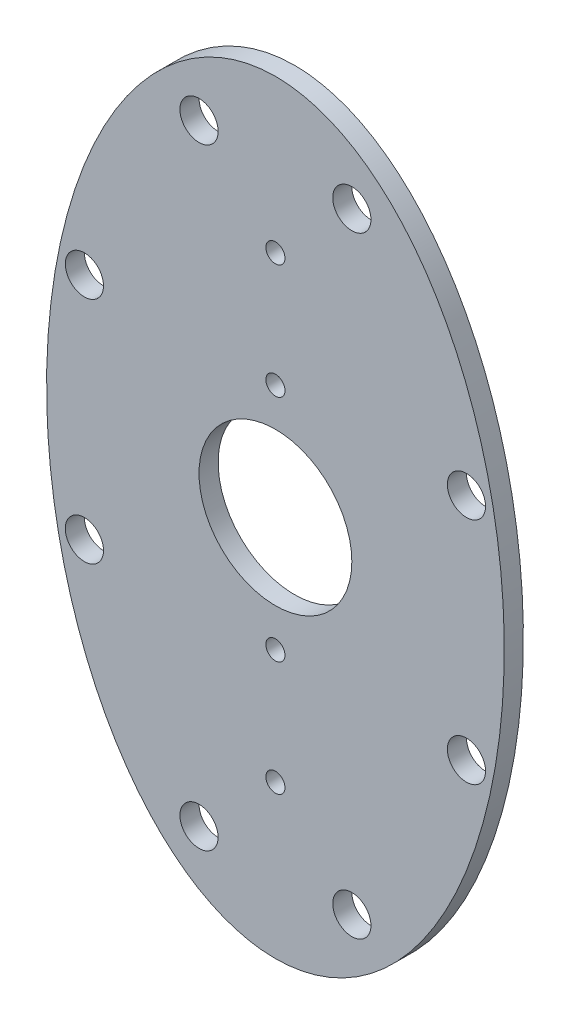
ISO-10303-21;
HEADER;
FILE_DESCRIPTION(('STEP AP214'),'2;1');
FILE_NAME('part.step','',(''),(''),'','','');
FILE_SCHEMA(('AUTOMOTIVE_DESIGN { 1 0 10303 214 1 1 1 1 }'));
ENDSEC;
DATA;
#1=APPLICATION_CONTEXT('core data for automotive mechanical design processes');
#2=APPLICATION_PROTOCOL_DEFINITION('international standard','automotive_design',2000,#1);
#3=PRODUCT_CONTEXT('',#1,'mechanical');
#4=PRODUCT('Part','Part','',(#3));
#5=PRODUCT_RELATED_PRODUCT_CATEGORY('part','',(#4));
#6=PRODUCT_DEFINITION_FORMATION('','',#4);
#7=PRODUCT_DEFINITION_CONTEXT('part definition',#1,'design');
#8=PRODUCT_DEFINITION('design','',#6,#7);
#9=PRODUCT_DEFINITION_SHAPE('','',#8);
#10=(LENGTH_UNIT() NAMED_UNIT(*) SI_UNIT(.MILLI.,.METRE.));
#11=(NAMED_UNIT(*) PLANE_ANGLE_UNIT() SI_UNIT($,.RADIAN.));
#12=(NAMED_UNIT(*) SI_UNIT($,.STERADIAN.) SOLID_ANGLE_UNIT());
#13=UNCERTAINTY_MEASURE_WITH_UNIT(LENGTH_MEASURE(1.E-05),#10,'distance_accuracy_value','');
#14=(GEOMETRIC_REPRESENTATION_CONTEXT(3) GLOBAL_UNCERTAINTY_ASSIGNED_CONTEXT((#13)) GLOBAL_UNIT_ASSIGNED_CONTEXT((#10,
#11,#12)) REPRESENTATION_CONTEXT('',''));
#15=CARTESIAN_POINT('',(0.,0.,0.));
#16=DIRECTION('',(0.,0.,1.));
#17=DIRECTION('',(1.,0.,0.));
#18=AXIS2_PLACEMENT_3D('',#15,#16,#17);
#19=CARTESIAN_POINT('',(0.,0.,12.7));
#20=DIRECTION('',(0.,0.,1.));
#21=DIRECTION('',(0.,1.,0.));
#22=AXIS2_PLACEMENT_3D('',#19,#20,#21);
#23=ELLIPSE('',#22,254.,152.143434343434);
#24=DIRECTION('',(0.,0.,-1.));
#25=VECTOR('',#24,1.);
#26=SURFACE_OF_LINEAR_EXTRUSION('',#23,#25);
#27=CARTESIAN_POINT('',(0.,254.,12.7));
#28=VERTEX_POINT('',#27);
#29=EDGE_CURVE('E10',#28,#28,#23,.T.);
#30=ORIENTED_EDGE('',*,*,#29,.F.);
#31=EDGE_LOOP('',(#30));
#32=FACE_BOUND('',#31,.T.);
#33=CARTESIAN_POINT('',(0.,0.,0.));
#34=DIRECTION('',(0.,0.,1.));
#35=DIRECTION('',(0.,1.,0.));
#36=AXIS2_PLACEMENT_3D('',#33,#34,#35);
#37=ELLIPSE('',#36,254.,152.143434343434);
#38=CARTESIAN_POINT('',(0.,254.,0.));
#39=VERTEX_POINT('',#38);
#40=EDGE_CURVE('E43',#39,#39,#37,.T.);
#41=ORIENTED_EDGE('',*,*,#40,.T.);
#42=EDGE_LOOP('',(#41));
#43=FACE_BOUND('',#42,.T.);
#44=ADVANCED_FACE('F39',(#32,#43),#26,.F.);
#45=CARTESIAN_POINT('',(0.,0.,12.7));
#46=DIRECTION('',(0.,0.,1.));
#47=DIRECTION('',(1.,0.,0.));
#48=AXIS2_PLACEMENT_3D('',#45,#46,#47);
#49=PLANE('',#48);
#50=CARTESIAN_POINT('',(-127.,-76.2,12.7));
#51=DIRECTION('',(0.,0.,1.));
#52=DIRECTION('',(1.,0.,0.));
#53=AXIS2_PLACEMENT_3D('',#50,#51,#52);
#54=CIRCLE('',#53,12.7);
#55=CARTESIAN_POINT('',(-114.3,-76.2,12.7));
#56=VERTEX_POINT('',#55);
#57=EDGE_CURVE('E85',#56,#56,#54,.T.);
#58=ORIENTED_EDGE('',*,*,#57,.F.);
#59=EDGE_LOOP('',(#58));
#60=FACE_BOUND('',#59,.T.);
#61=CARTESIAN_POINT('',(-127.,76.2,12.7));
#62=DIRECTION('',(0.,0.,1.));
#63=DIRECTION('',(1.,0.,0.));
#64=AXIS2_PLACEMENT_3D('',#61,#62,#63);
#65=CIRCLE('',#64,12.7);
#66=CARTESIAN_POINT('',(-114.3,76.2,12.7));
#67=VERTEX_POINT('',#66);
#68=EDGE_CURVE('E92',#67,#67,#65,.T.);
#69=ORIENTED_EDGE('',*,*,#68,.F.);
#70=EDGE_LOOP('',(#69));
#71=FACE_BOUND('',#70,.T.);
#72=CARTESIAN_POINT('',(50.8,-203.2,12.7));
#73=DIRECTION('',(0.,0.,1.));
#74=DIRECTION('',(1.,0.,0.));
#75=AXIS2_PLACEMENT_3D('',#72,#73,#74);
#76=CIRCLE('',#75,12.7);
#77=CARTESIAN_POINT('',(63.5,-203.2,12.7));
#78=VERTEX_POINT('',#77);
#79=EDGE_CURVE('E98',#78,#78,#76,.T.);
#80=ORIENTED_EDGE('',*,*,#79,.F.);
#81=EDGE_LOOP('',(#80));
#82=FACE_BOUND('',#81,.T.);
#83=CARTESIAN_POINT('',(-50.8,-203.2,12.7));
#84=DIRECTION('',(0.,0.,1.));
#85=DIRECTION('',(1.,0.,0.));
#86=AXIS2_PLACEMENT_3D('',#83,#84,#85);
#87=CIRCLE('',#86,12.7);
#88=CARTESIAN_POINT('',(-38.1,-203.2,12.7));
#89=VERTEX_POINT('',#88);
#90=EDGE_CURVE('E62',#89,#89,#87,.T.);
#91=ORIENTED_EDGE('',*,*,#90,.F.);
#92=EDGE_LOOP('',(#91));
#93=FACE_BOUND('',#92,.T.);
#94=CARTESIAN_POINT('',(127.,-76.2,12.7));
#95=DIRECTION('',(0.,0.,1.));
#96=DIRECTION('',(1.,0.,0.));
#97=AXIS2_PLACEMENT_3D('',#94,#95,#96);
#98=CIRCLE('',#97,12.7);
#99=CARTESIAN_POINT('',(139.7,-76.2,12.7));
#100=VERTEX_POINT('',#99);
#101=EDGE_CURVE('E61',#100,#100,#98,.T.);
#102=ORIENTED_EDGE('',*,*,#101,.F.);
#103=EDGE_LOOP('',(#102));
#104=FACE_BOUND('',#103,.T.);
#105=CARTESIAN_POINT('',(127.,76.2,12.7));
#106=DIRECTION('',(0.,0.,1.));
#107=DIRECTION('',(1.,0.,0.));
#108=AXIS2_PLACEMENT_3D('',#105,#106,#107);
#109=CIRCLE('',#108,12.7);
#110=CARTESIAN_POINT('',(139.7,76.2,12.7));
#111=VERTEX_POINT('',#110);
#112=EDGE_CURVE('E68',#111,#111,#109,.T.);
#113=ORIENTED_EDGE('',*,*,#112,.F.);
#114=EDGE_LOOP('',(#113));
#115=FACE_BOUND('',#114,.T.);
#116=CARTESIAN_POINT('',(50.8,203.2,12.7));
#117=DIRECTION('',(0.,0.,1.));
#118=DIRECTION('',(1.,0.,0.));
#119=AXIS2_PLACEMENT_3D('',#116,#117,#118);
#120=CIRCLE('',#119,12.7);
#121=CARTESIAN_POINT('',(63.5,203.2,12.7));
#122=VERTEX_POINT('',#121);
#123=EDGE_CURVE('E74',#122,#122,#120,.T.);
#124=ORIENTED_EDGE('',*,*,#123,.F.);
#125=EDGE_LOOP('',(#124));
#126=FACE_BOUND('',#125,.T.);
#127=CARTESIAN_POINT('',(-50.8,203.2,12.7));
#128=DIRECTION('',(0.,0.,1.));
#129=DIRECTION('',(1.,0.,0.));
#130=AXIS2_PLACEMENT_3D('',#127,#128,#129);
#131=CIRCLE('',#130,12.7);
#132=CARTESIAN_POINT('',(-38.1,203.2,12.7));
#133=VERTEX_POINT('',#132);
#134=EDGE_CURVE('E55',#133,#133,#131,.T.);
#135=ORIENTED_EDGE('',*,*,#134,.F.);
#136=EDGE_LOOP('',(#135));
#137=FACE_BOUND('',#136,.T.);
#138=CARTESIAN_POINT('',(0.,76.2,12.7));
#139=DIRECTION('',(0.,0.,1.));
#140=DIRECTION('',(1.,0.,0.));
#141=AXIS2_PLACEMENT_3D('',#138,#139,#140);
#142=CIRCLE('',#141,6.35);
#143=CARTESIAN_POINT('',(6.35000000000003,76.2,12.7));
#144=VERTEX_POINT('',#143);
#145=EDGE_CURVE('E86',#144,#144,#142,.T.);
#146=ORIENTED_EDGE('',*,*,#145,.F.);
#147=EDGE_LOOP('',(#146));
#148=FACE_BOUND('',#147,.T.);
#149=CARTESIAN_POINT('',(0.,152.4,12.7));
#150=DIRECTION('',(0.,0.,1.));
#151=DIRECTION('',(1.,0.,0.));
#152=AXIS2_PLACEMENT_3D('',#149,#150,#151);
#153=CIRCLE('',#152,6.35);
#154=CARTESIAN_POINT('',(6.35000000000002,152.4,12.7));
#155=VERTEX_POINT('',#154);
#156=EDGE_CURVE('E121',#155,#155,#153,.T.);
#157=ORIENTED_EDGE('',*,*,#156,.F.);
#158=EDGE_LOOP('',(#157));
#159=FACE_BOUND('',#158,.T.);
#160=CARTESIAN_POINT('',(0.,-76.2,12.7));
#161=DIRECTION('',(0.,0.,1.));
#162=DIRECTION('',(1.,0.,0.));
#163=AXIS2_PLACEMENT_3D('',#160,#161,#162);
#164=CIRCLE('',#163,6.35);
#165=CARTESIAN_POINT('',(6.35000000000005,-76.2,12.7));
#166=VERTEX_POINT('',#165);
#167=EDGE_CURVE('E115',#166,#166,#164,.T.);
#168=ORIENTED_EDGE('',*,*,#167,.F.);
#169=EDGE_LOOP('',(#168));
#170=FACE_BOUND('',#169,.T.);
#171=CARTESIAN_POINT('',(0.,-152.4,12.7));
#172=DIRECTION('',(0.,0.,1.));
#173=DIRECTION('',(1.,0.,0.));
#174=AXIS2_PLACEMENT_3D('',#171,#172,#173);
#175=CIRCLE('',#174,6.35);
#176=CARTESIAN_POINT('',(6.35000000000006,-152.4,12.7));
#177=VERTEX_POINT('',#176);
#178=EDGE_CURVE('E109',#177,#177,#175,.T.);
#179=ORIENTED_EDGE('',*,*,#178,.F.);
#180=EDGE_LOOP('',(#179));
#181=FACE_BOUND('',#180,.T.);
#182=CARTESIAN_POINT('',(0.,0.,12.7));
#183=DIRECTION('',(0.,0.,1.));
#184=DIRECTION('',(1.,0.,0.));
#185=AXIS2_PLACEMENT_3D('',#182,#183,#184);
#186=CIRCLE('',#185,50.8);
#187=CARTESIAN_POINT('',(50.8,0.,12.7));
#188=VERTEX_POINT('',#187);
#189=EDGE_CURVE('E52',#188,#188,#186,.T.);
#190=ORIENTED_EDGE('',*,*,#189,.F.);
#191=EDGE_LOOP('',(#190));
#192=FACE_BOUND('',#191,.T.);
#193=ORIENTED_EDGE('',*,*,#29,.T.);
#194=EDGE_LOOP('',(#193));
#195=FACE_BOUND('',#194,.T.);
#196=ADVANCED_FACE('F132',(#60,#71,#82,#93,#104,#115,#126,#137,#148,#159,#170,#181,#192,#195),
#49,.T.);
#197=CARTESIAN_POINT('',(0.,0.,0.));
#198=DIRECTION('',(0.,0.,1.));
#199=DIRECTION('',(1.,0.,0.));
#200=AXIS2_PLACEMENT_3D('',#197,#198,#199);
#201=PLANE('',#200);
#202=CARTESIAN_POINT('',(-127.,-76.2,0.));
#203=DIRECTION('',(0.,0.,1.));
#204=DIRECTION('',(1.,0.,0.));
#205=AXIS2_PLACEMENT_3D('',#202,#203,#204);
#206=CIRCLE('',#205,12.7);
#207=CARTESIAN_POINT('',(-114.3,-76.2,0.));
#208=VERTEX_POINT('',#207);
#209=EDGE_CURVE('E82',#208,#208,#206,.T.);
#210=ORIENTED_EDGE('',*,*,#209,.T.);
#211=EDGE_LOOP('',(#210));
#212=FACE_BOUND('',#211,.T.);
#213=CARTESIAN_POINT('',(-127.,76.2,0.));
#214=DIRECTION('',(0.,0.,1.));
#215=DIRECTION('',(1.,0.,0.));
#216=AXIS2_PLACEMENT_3D('',#213,#214,#215);
#217=CIRCLE('',#216,12.7);
#218=CARTESIAN_POINT('',(-114.3,76.2,0.));
#219=VERTEX_POINT('',#218);
#220=EDGE_CURVE('E89',#219,#219,#217,.T.);
#221=ORIENTED_EDGE('',*,*,#220,.T.);
#222=EDGE_LOOP('',(#221));
#223=FACE_BOUND('',#222,.T.);
#224=CARTESIAN_POINT('',(50.8,-203.2,0.));
#225=DIRECTION('',(0.,0.,1.));
#226=DIRECTION('',(1.,0.,0.));
#227=AXIS2_PLACEMENT_3D('',#224,#225,#226);
#228=CIRCLE('',#227,12.7);
#229=CARTESIAN_POINT('',(63.5,-203.2,0.));
#230=VERTEX_POINT('',#229);
#231=EDGE_CURVE('E95',#230,#230,#228,.T.);
#232=ORIENTED_EDGE('',*,*,#231,.T.);
#233=EDGE_LOOP('',(#232));
#234=FACE_BOUND('',#233,.T.);
#235=CARTESIAN_POINT('',(-50.8,-203.2,0.));
#236=DIRECTION('',(0.,0.,1.));
#237=DIRECTION('',(1.,0.,0.));
#238=AXIS2_PLACEMENT_3D('',#235,#236,#237);
#239=CIRCLE('',#238,12.7);
#240=CARTESIAN_POINT('',(-38.1,-203.2,0.));
#241=VERTEX_POINT('',#240);
#242=EDGE_CURVE('E101',#241,#241,#239,.T.);
#243=ORIENTED_EDGE('',*,*,#242,.T.);
#244=EDGE_LOOP('',(#243));
#245=FACE_BOUND('',#244,.T.);
#246=CARTESIAN_POINT('',(127.,-76.2,0.));
#247=DIRECTION('',(0.,0.,1.));
#248=DIRECTION('',(1.,0.,0.));
#249=AXIS2_PLACEMENT_3D('',#246,#247,#248);
#250=CIRCLE('',#249,12.7);
#251=CARTESIAN_POINT('',(139.7,-76.2,0.));
#252=VERTEX_POINT('',#251);
#253=EDGE_CURVE('E58',#252,#252,#250,.T.);
#254=ORIENTED_EDGE('',*,*,#253,.T.);
#255=EDGE_LOOP('',(#254));
#256=FACE_BOUND('',#255,.T.);
#257=CARTESIAN_POINT('',(127.,76.2,0.));
#258=DIRECTION('',(0.,0.,1.));
#259=DIRECTION('',(1.,0.,0.));
#260=AXIS2_PLACEMENT_3D('',#257,#258,#259);
#261=CIRCLE('',#260,12.7);
#262=CARTESIAN_POINT('',(139.7,76.2,0.));
#263=VERTEX_POINT('',#262);
#264=EDGE_CURVE('E65',#263,#263,#261,.T.);
#265=ORIENTED_EDGE('',*,*,#264,.T.);
#266=EDGE_LOOP('',(#265));
#267=FACE_BOUND('',#266,.T.);
#268=CARTESIAN_POINT('',(50.8,203.2,0.));
#269=DIRECTION('',(0.,0.,1.));
#270=DIRECTION('',(1.,0.,0.));
#271=AXIS2_PLACEMENT_3D('',#268,#269,#270);
#272=CIRCLE('',#271,12.7);
#273=CARTESIAN_POINT('',(63.5,203.2,0.));
#274=VERTEX_POINT('',#273);
#275=EDGE_CURVE('E71',#274,#274,#272,.T.);
#276=ORIENTED_EDGE('',*,*,#275,.T.);
#277=EDGE_LOOP('',(#276));
#278=FACE_BOUND('',#277,.T.);
#279=CARTESIAN_POINT('',(-50.8,203.2,0.));
#280=DIRECTION('',(0.,0.,1.));
#281=DIRECTION('',(1.,0.,0.));
#282=AXIS2_PLACEMENT_3D('',#279,#280,#281);
#283=CIRCLE('',#282,12.7);
#284=CARTESIAN_POINT('',(-38.1,203.2,0.));
#285=VERTEX_POINT('',#284);
#286=EDGE_CURVE('E77',#285,#285,#283,.T.);
#287=ORIENTED_EDGE('',*,*,#286,.T.);
#288=EDGE_LOOP('',(#287));
#289=FACE_BOUND('',#288,.T.);
#290=CARTESIAN_POINT('',(0.,76.2,0.));
#291=DIRECTION('',(0.,0.,1.));
#292=DIRECTION('',(1.,0.,0.));
#293=AXIS2_PLACEMENT_3D('',#290,#291,#292);
#294=CIRCLE('',#293,6.35);
#295=CARTESIAN_POINT('',(6.35000000000003,76.2,0.));
#296=VERTEX_POINT('',#295);
#297=EDGE_CURVE('E124',#296,#296,#294,.T.);
#298=ORIENTED_EDGE('',*,*,#297,.T.);
#299=EDGE_LOOP('',(#298));
#300=FACE_BOUND('',#299,.T.);
#301=CARTESIAN_POINT('',(0.,152.4,0.));
#302=DIRECTION('',(0.,0.,1.));
#303=DIRECTION('',(1.,0.,0.));
#304=AXIS2_PLACEMENT_3D('',#301,#302,#303);
#305=CIRCLE('',#304,6.35);
#306=CARTESIAN_POINT('',(6.35000000000002,152.4,0.));
#307=VERTEX_POINT('',#306);
#308=EDGE_CURVE('E118',#307,#307,#305,.T.);
#309=ORIENTED_EDGE('',*,*,#308,.T.);
#310=EDGE_LOOP('',(#309));
#311=FACE_BOUND('',#310,.T.);
#312=CARTESIAN_POINT('',(0.,-76.2,0.));
#313=DIRECTION('',(0.,0.,1.));
#314=DIRECTION('',(1.,0.,0.));
#315=AXIS2_PLACEMENT_3D('',#312,#313,#314);
#316=CIRCLE('',#315,6.35);
#317=CARTESIAN_POINT('',(6.35000000000005,-76.2,0.));
#318=VERTEX_POINT('',#317);
#319=EDGE_CURVE('E112',#318,#318,#316,.T.);
#320=ORIENTED_EDGE('',*,*,#319,.T.);
#321=EDGE_LOOP('',(#320));
#322=FACE_BOUND('',#321,.T.);
#323=CARTESIAN_POINT('',(0.,-152.4,0.));
#324=DIRECTION('',(0.,0.,1.));
#325=DIRECTION('',(1.,0.,0.));
#326=AXIS2_PLACEMENT_3D('',#323,#324,#325);
#327=CIRCLE('',#326,6.35);
#328=CARTESIAN_POINT('',(6.35000000000006,-152.4,0.));
#329=VERTEX_POINT('',#328);
#330=EDGE_CURVE('E106',#329,#329,#327,.T.);
#331=ORIENTED_EDGE('',*,*,#330,.T.);
#332=EDGE_LOOP('',(#331));
#333=FACE_BOUND('',#332,.T.);
#334=CARTESIAN_POINT('',(0.,0.,0.));
#335=DIRECTION('',(0.,0.,1.));
#336=DIRECTION('',(1.,0.,0.));
#337=AXIS2_PLACEMENT_3D('',#334,#335,#336);
#338=CIRCLE('',#337,50.8);
#339=CARTESIAN_POINT('',(50.8,0.,0.));
#340=VERTEX_POINT('',#339);
#341=EDGE_CURVE('E49',#340,#340,#338,.T.);
#342=ORIENTED_EDGE('',*,*,#341,.T.);
#343=EDGE_LOOP('',(#342));
#344=FACE_BOUND('',#343,.T.);
#345=ORIENTED_EDGE('',*,*,#40,.F.);
#346=EDGE_LOOP('',(#345));
#347=FACE_BOUND('',#346,.T.);
#348=ADVANCED_FACE('F135',(#212,#223,#234,#245,#256,#267,#278,#289,#300,#311,#322,#333,#344,
#347),#201,.F.);
#349=CARTESIAN_POINT('',(0.,0.,0.));
#350=DIRECTION('',(0.,0.,1.));
#351=DIRECTION('',(1.,0.,0.));
#352=AXIS2_PLACEMENT_3D('',#349,#350,#351);
#353=CYLINDRICAL_SURFACE('',#352,50.8);
#354=ORIENTED_EDGE('',*,*,#341,.F.);
#355=EDGE_LOOP('',(#354));
#356=FACE_BOUND('',#355,.T.);
#357=ORIENTED_EDGE('',*,*,#189,.T.);
#358=EDGE_LOOP('',(#357));
#359=FACE_BOUND('',#358,.T.);
#360=ADVANCED_FACE('F146',(#356,#359),#353,.F.);
#361=CARTESIAN_POINT('',(0.,-152.4,0.));
#362=DIRECTION('',(0.,0.,1.));
#363=DIRECTION('',(1.,0.,0.));
#364=AXIS2_PLACEMENT_3D('',#361,#362,#363);
#365=CYLINDRICAL_SURFACE('',#364,6.35);
#366=ORIENTED_EDGE('',*,*,#330,.F.);
#367=EDGE_LOOP('',(#366));
#368=FACE_BOUND('',#367,.T.);
#369=ORIENTED_EDGE('',*,*,#178,.T.);
#370=EDGE_LOOP('',(#369));
#371=FACE_BOUND('',#370,.T.);
#372=ADVANCED_FACE('F148',(#368,#371),#365,.F.);
#373=CARTESIAN_POINT('',(0.,-76.2,0.));
#374=DIRECTION('',(0.,0.,1.));
#375=DIRECTION('',(1.,0.,0.));
#376=AXIS2_PLACEMENT_3D('',#373,#374,#375);
#377=CYLINDRICAL_SURFACE('',#376,6.35);
#378=ORIENTED_EDGE('',*,*,#319,.F.);
#379=EDGE_LOOP('',(#378));
#380=FACE_BOUND('',#379,.T.);
#381=ORIENTED_EDGE('',*,*,#167,.T.);
#382=EDGE_LOOP('',(#381));
#383=FACE_BOUND('',#382,.T.);
#384=ADVANCED_FACE('F155',(#380,#383),#377,.F.);
#385=CARTESIAN_POINT('',(0.,152.4,0.));
#386=DIRECTION('',(0.,0.,1.));
#387=DIRECTION('',(1.,0.,0.));
#388=AXIS2_PLACEMENT_3D('',#385,#386,#387);
#389=CYLINDRICAL_SURFACE('',#388,6.35);
#390=ORIENTED_EDGE('',*,*,#308,.F.);
#391=EDGE_LOOP('',(#390));
#392=FACE_BOUND('',#391,.T.);
#393=ORIENTED_EDGE('',*,*,#156,.T.);
#394=EDGE_LOOP('',(#393));
#395=FACE_BOUND('',#394,.T.);
#396=ADVANCED_FACE('F198',(#392,#395),#389,.F.);
#397=CARTESIAN_POINT('',(0.,76.2,0.));
#398=DIRECTION('',(0.,0.,1.));
#399=DIRECTION('',(1.,0.,0.));
#400=AXIS2_PLACEMENT_3D('',#397,#398,#399);
#401=CYLINDRICAL_SURFACE('',#400,6.35);
#402=ORIENTED_EDGE('',*,*,#297,.F.);
#403=EDGE_LOOP('',(#402));
#404=FACE_BOUND('',#403,.T.);
#405=ORIENTED_EDGE('',*,*,#145,.T.);
#406=EDGE_LOOP('',(#405));
#407=FACE_BOUND('',#406,.T.);
#408=ADVANCED_FACE('F130',(#404,#407),#401,.F.);
#409=CARTESIAN_POINT('',(-50.8,203.2,0.));
#410=DIRECTION('',(0.,0.,1.));
#411=DIRECTION('',(1.,0.,0.));
#412=AXIS2_PLACEMENT_3D('',#409,#410,#411);
#413=CYLINDRICAL_SURFACE('',#412,12.7);
#414=ORIENTED_EDGE('',*,*,#286,.F.);
#415=EDGE_LOOP('',(#414));
#416=FACE_BOUND('',#415,.T.);
#417=ORIENTED_EDGE('',*,*,#134,.T.);
#418=EDGE_LOOP('',(#417));
#419=FACE_BOUND('',#418,.T.);
#420=ADVANCED_FACE('F217',(#416,#419),#413,.F.);
#421=CARTESIAN_POINT('',(50.8,203.2,0.));
#422=DIRECTION('',(0.,0.,1.));
#423=DIRECTION('',(1.,0.,0.));
#424=AXIS2_PLACEMENT_3D('',#421,#422,#423);
#425=CYLINDRICAL_SURFACE('',#424,12.7);
#426=ORIENTED_EDGE('',*,*,#275,.F.);
#427=EDGE_LOOP('',(#426));
#428=FACE_BOUND('',#427,.T.);
#429=ORIENTED_EDGE('',*,*,#123,.T.);
#430=EDGE_LOOP('',(#429));
#431=FACE_BOUND('',#430,.T.);
#432=ADVANCED_FACE('F227',(#428,#431),#425,.F.);
#433=CARTESIAN_POINT('',(127.,76.2,0.));
#434=DIRECTION('',(0.,0.,1.));
#435=DIRECTION('',(1.,0.,0.));
#436=AXIS2_PLACEMENT_3D('',#433,#434,#435);
#437=CYLINDRICAL_SURFACE('',#436,12.7);
#438=ORIENTED_EDGE('',*,*,#264,.F.);
#439=EDGE_LOOP('',(#438));
#440=FACE_BOUND('',#439,.T.);
#441=ORIENTED_EDGE('',*,*,#112,.T.);
#442=EDGE_LOOP('',(#441));
#443=FACE_BOUND('',#442,.T.);
#444=ADVANCED_FACE('F237',(#440,#443),#437,.F.);
#445=CARTESIAN_POINT('',(127.,-76.2,0.));
#446=DIRECTION('',(0.,0.,1.));
#447=DIRECTION('',(1.,0.,0.));
#448=AXIS2_PLACEMENT_3D('',#445,#446,#447);
#449=CYLINDRICAL_SURFACE('',#448,12.7);
#450=ORIENTED_EDGE('',*,*,#253,.F.);
#451=EDGE_LOOP('',(#450));
#452=FACE_BOUND('',#451,.T.);
#453=ORIENTED_EDGE('',*,*,#101,.T.);
#454=EDGE_LOOP('',(#453));
#455=FACE_BOUND('',#454,.T.);
#456=ADVANCED_FACE('F247',(#452,#455),#449,.F.);
#457=CARTESIAN_POINT('',(-50.8,-203.2,0.));
#458=DIRECTION('',(0.,0.,1.));
#459=DIRECTION('',(1.,0.,0.));
#460=AXIS2_PLACEMENT_3D('',#457,#458,#459);
#461=CYLINDRICAL_SURFACE('',#460,12.7);
#462=ORIENTED_EDGE('',*,*,#242,.F.);
#463=EDGE_LOOP('',(#462));
#464=FACE_BOUND('',#463,.T.);
#465=ORIENTED_EDGE('',*,*,#90,.T.);
#466=EDGE_LOOP('',(#465));
#467=FACE_BOUND('',#466,.T.);
#468=ADVANCED_FACE('F257',(#464,#467),#461,.F.);
#469=CARTESIAN_POINT('',(50.8,-203.2,0.));
#470=DIRECTION('',(0.,0.,1.));
#471=DIRECTION('',(1.,0.,0.));
#472=AXIS2_PLACEMENT_3D('',#469,#470,#471);
#473=CYLINDRICAL_SURFACE('',#472,12.7);
#474=ORIENTED_EDGE('',*,*,#231,.F.);
#475=EDGE_LOOP('',(#474));
#476=FACE_BOUND('',#475,.T.);
#477=ORIENTED_EDGE('',*,*,#79,.T.);
#478=EDGE_LOOP('',(#477));
#479=FACE_BOUND('',#478,.T.);
#480=ADVANCED_FACE('F266',(#476,#479),#473,.F.);
#481=CARTESIAN_POINT('',(-127.,76.2,0.));
#482=DIRECTION('',(0.,0.,1.));
#483=DIRECTION('',(1.,0.,0.));
#484=AXIS2_PLACEMENT_3D('',#481,#482,#483);
#485=CYLINDRICAL_SURFACE('',#484,12.7);
#486=ORIENTED_EDGE('',*,*,#220,.F.);
#487=EDGE_LOOP('',(#486));
#488=FACE_BOUND('',#487,.T.);
#489=ORIENTED_EDGE('',*,*,#68,.T.);
#490=EDGE_LOOP('',(#489));
#491=FACE_BOUND('',#490,.T.);
#492=ADVANCED_FACE('F276',(#488,#491),#485,.F.);
#493=CARTESIAN_POINT('',(-127.,-76.2,0.));
#494=DIRECTION('',(0.,0.,1.));
#495=DIRECTION('',(1.,0.,0.));
#496=AXIS2_PLACEMENT_3D('',#493,#494,#495);
#497=CYLINDRICAL_SURFACE('',#496,12.7);
#498=ORIENTED_EDGE('',*,*,#209,.F.);
#499=EDGE_LOOP('',(#498));
#500=FACE_BOUND('',#499,.T.);
#501=ORIENTED_EDGE('',*,*,#57,.T.);
#502=EDGE_LOOP('',(#501));
#503=FACE_BOUND('',#502,.T.);
#504=ADVANCED_FACE('F286',(#500,#503),#497,.F.);
#505=CLOSED_SHELL('',(#44,#196,#348,#360,#372,#384,#396,#408,#420,#432,#444,#456,#468,#480,#492,#504));
#506=MANIFOLD_SOLID_BREP('B2',#505);
#507=ADVANCED_BREP_SHAPE_REPRESENTATION('',(#18,#506),#14);
#508=SHAPE_DEFINITION_REPRESENTATION(#9,#507);
ENDSEC;
END-ISO-10303-21;
